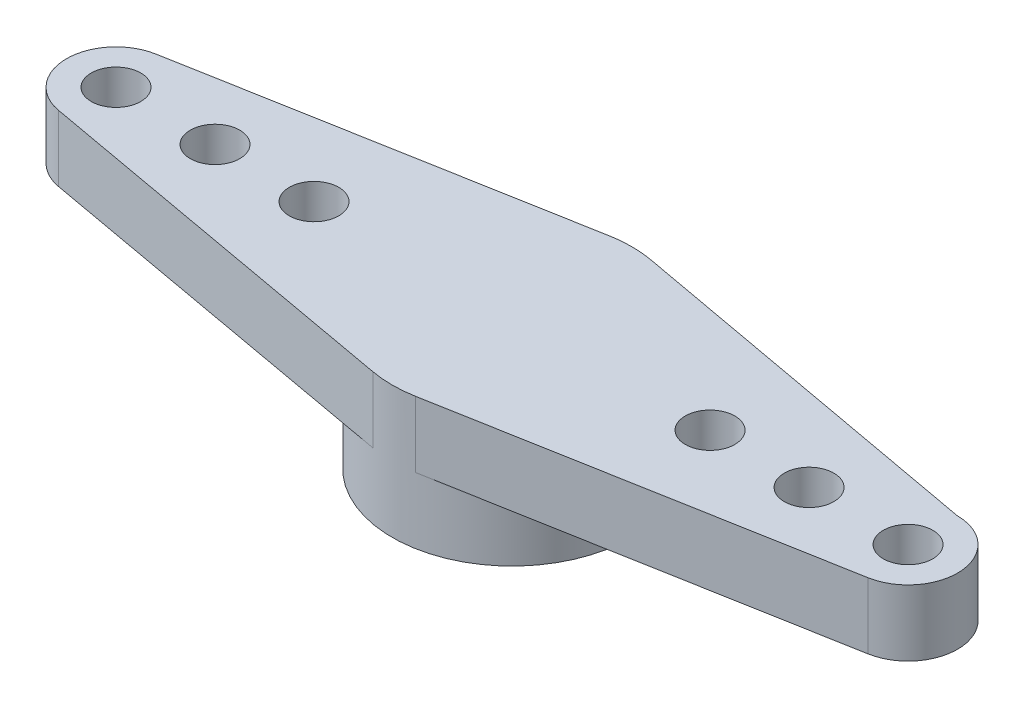
ISO-10303-21;
HEADER;
FILE_DESCRIPTION(('STEP AP214'),'2;1');
FILE_NAME('part.step','',(''),(''),'','','');
FILE_SCHEMA(('AUTOMOTIVE_DESIGN { 1 0 10303 214 1 1 1 1 }'));
ENDSEC;
DATA;
#1=APPLICATION_CONTEXT('core data for automotive mechanical design processes');
#2=APPLICATION_PROTOCOL_DEFINITION('international standard','automotive_design',2000,#1);
#3=PRODUCT_CONTEXT('',#1,'mechanical');
#4=PRODUCT('Part','Part','',(#3));
#5=PRODUCT_RELATED_PRODUCT_CATEGORY('part','',(#4));
#6=PRODUCT_DEFINITION_FORMATION('','',#4);
#7=PRODUCT_DEFINITION_CONTEXT('part definition',#1,'design');
#8=PRODUCT_DEFINITION('design','',#6,#7);
#9=PRODUCT_DEFINITION_SHAPE('','',#8);
#10=(LENGTH_UNIT() NAMED_UNIT(*) SI_UNIT(.MILLI.,.METRE.));
#11=(NAMED_UNIT(*) PLANE_ANGLE_UNIT() SI_UNIT($,.RADIAN.));
#12=(NAMED_UNIT(*) SI_UNIT($,.STERADIAN.) SOLID_ANGLE_UNIT());
#13=UNCERTAINTY_MEASURE_WITH_UNIT(LENGTH_MEASURE(1.E-05),#10,'distance_accuracy_value','');
#14=(GEOMETRIC_REPRESENTATION_CONTEXT(3) GLOBAL_UNCERTAINTY_ASSIGNED_CONTEXT((#13)) GLOBAL_UNIT_ASSIGNED_CONTEXT((#10,
#11,#12)) REPRESENTATION_CONTEXT('',''));
#15=CARTESIAN_POINT('',(0.,0.,0.));
#16=DIRECTION('',(0.,0.,1.));
#17=DIRECTION('',(1.,0.,0.));
#18=AXIS2_PLACEMENT_3D('',#15,#16,#17);
#19=CARTESIAN_POINT('',(-12.,0.,0.));
#20=DIRECTION('',(0.,1.,0.));
#21=DIRECTION('',(0.,0.,1.));
#22=AXIS2_PLACEMENT_3D('',#19,#20,#21);
#23=PLANE('',#22);
#24=CARTESIAN_POINT('',(0.,0.,0.));
#25=DIRECTION('',(0.,-1.,0.));
#26=DIRECTION('',(0.,0.,-1.));
#27=AXIS2_PLACEMENT_3D('',#24,#25,#26);
#28=CIRCLE('',#27,3.63);
#29=CARTESIAN_POINT('',(0.651697383078079,0.,-3.57102093537537));
#30=VERTEX_POINT('',#29);
#31=CARTESIAN_POINT('',(0.644325,0.,3.57235850585786));
#32=VERTEX_POINT('',#31);
#33=EDGE_CURVE('E48',#30,#32,#28,.T.);
#34=ORIENTED_EDGE('',*,*,#33,.F.);
#35=DIRECTION('',(-0.983752323794868,0.,-0.179530959525641));
#36=VECTOR('',#35,1.);
#37=CARTESIAN_POINT('',(0.651697383078079,0.,-3.57102093537537));
#38=LINE('',#37,#36);
#39=CARTESIAN_POINT('',(12.,0.,-1.5));
#40=VERTEX_POINT('',#39);
#41=EDGE_CURVE('E122',#40,#30,#38,.T.);
#42=ORIENTED_EDGE('',*,*,#41,.F.);
#43=CARTESIAN_POINT('',(12.,0.,0.));
#44=DIRECTION('',(0.,1.,0.));
#45=DIRECTION('',(0.,0.,1.));
#46=AXIS2_PLACEMENT_3D('',#43,#44,#45);
#47=CIRCLE('',#46,1.5);
#48=CARTESIAN_POINT('',(12.26625,0.,1.47618120076771));
#49=VERTEX_POINT('',#48);
#50=EDGE_CURVE('E143',#49,#40,#47,.T.);
#51=ORIENTED_EDGE('',*,*,#50,.F.);
#52=DIRECTION('',(0.984120800511807,0.,-0.1775));
#53=VECTOR('',#52,1.);
#54=CARTESIAN_POINT('',(0.644325,0.,3.57235850585786));
#55=LINE('',#54,#53);
#56=EDGE_CURVE('E141',#32,#49,#55,.T.);
#57=ORIENTED_EDGE('',*,*,#56,.F.);
#58=EDGE_LOOP('',(#34,#42,#51,#57));
#59=FACE_BOUND('',#58,.T.);
#60=CARTESIAN_POINT('',(6.,0.,0.));
#61=DIRECTION('',(0.,1.,0.));
#62=DIRECTION('',(0.,0.,1.));
#63=AXIS2_PLACEMENT_3D('',#60,#61,#62);
#64=CIRCLE('',#63,0.75);
#65=CARTESIAN_POINT('',(6.,0.,0.750000000000042));
#66=VERTEX_POINT('',#65);
#67=EDGE_CURVE('E187',#66,#66,#64,.T.);
#68=ORIENTED_EDGE('',*,*,#67,.T.);
#69=EDGE_LOOP('',(#68));
#70=FACE_BOUND('',#69,.T.);
#71=CARTESIAN_POINT('',(9.,0.,0.));
#72=DIRECTION('',(0.,1.,0.));
#73=DIRECTION('',(0.,0.,1.));
#74=AXIS2_PLACEMENT_3D('',#71,#72,#73);
#75=CIRCLE('',#74,0.75);
#76=CARTESIAN_POINT('',(9.,0.,0.750000000000021));
#77=VERTEX_POINT('',#76);
#78=EDGE_CURVE('E210',#77,#77,#75,.T.);
#79=ORIENTED_EDGE('',*,*,#78,.T.);
#80=EDGE_LOOP('',(#79));
#81=FACE_BOUND('',#80,.T.);
#82=CARTESIAN_POINT('',(12.,0.,0.));
#83=DIRECTION('',(0.,1.,0.));
#84=DIRECTION('',(0.,0.,1.));
#85=AXIS2_PLACEMENT_3D('',#82,#83,#84);
#86=CIRCLE('',#85,0.75);
#87=CARTESIAN_POINT('',(12.,0.,0.75));
#88=VERTEX_POINT('',#87);
#89=EDGE_CURVE('E138',#88,#88,#86,.T.);
#90=ORIENTED_EDGE('',*,*,#89,.T.);
#91=EDGE_LOOP('',(#90));
#92=FACE_BOUND('',#91,.T.);
#93=ADVANCED_FACE('F37',(#59,#70,#81,#92),#23,.F.);
#94=CARTESIAN_POINT('',(-12.,2.,0.));
#95=DIRECTION('',(0.,-1.,0.));
#96=DIRECTION('',(0.,0.,-1.));
#97=AXIS2_PLACEMENT_3D('',#94,#95,#96);
#98=CYLINDRICAL_SURFACE('',#97,1.5);
#99=CARTESIAN_POINT('',(-12.,0.,0.));
#100=DIRECTION('',(0.,1.,0.));
#101=DIRECTION('',(0.,0.,1.));
#102=AXIS2_PLACEMENT_3D('',#99,#100,#101);
#103=CIRCLE('',#102,1.5);
#104=CARTESIAN_POINT('',(-12.26625,0.,-1.47618120076771));
#105=VERTEX_POINT('',#104);
#106=CARTESIAN_POINT('',(-12.26625,0.,1.47618120076771));
#107=VERTEX_POINT('',#106);
#108=EDGE_CURVE('E134',#105,#107,#103,.T.);
#109=ORIENTED_EDGE('',*,*,#108,.T.);
#110=DIRECTION('',(0.,-1.,0.));
#111=VECTOR('',#110,1.);
#112=CARTESIAN_POINT('',(-12.26625,2.,1.47618120076771));
#113=LINE('',#112,#111);
#114=CARTESIAN_POINT('',(-12.26625,2.,1.47618120076771));
#115=VERTEX_POINT('',#114);
#116=EDGE_CURVE('E41',#115,#107,#113,.T.);
#117=ORIENTED_EDGE('',*,*,#116,.F.);
#118=CARTESIAN_POINT('',(-12.,2.,0.));
#119=DIRECTION('',(0.,1.,0.));
#120=DIRECTION('',(0.,0.,1.));
#121=AXIS2_PLACEMENT_3D('',#118,#119,#120);
#122=CIRCLE('',#121,1.5);
#123=CARTESIAN_POINT('',(-12.26625,2.,-1.47618120076771));
#124=VERTEX_POINT('',#123);
#125=EDGE_CURVE('E147',#124,#115,#122,.T.);
#126=ORIENTED_EDGE('',*,*,#125,.F.);
#127=DIRECTION('',(0.,-1.,0.));
#128=VECTOR('',#127,1.);
#129=CARTESIAN_POINT('',(-12.26625,2.,-1.47618120076771));
#130=LINE('',#129,#128);
#131=EDGE_CURVE('E130',#124,#105,#130,.T.);
#132=ORIENTED_EDGE('',*,*,#131,.T.);
#133=EDGE_LOOP('',(#109,#117,#126,#132));
#134=FACE_BOUND('',#133,.T.);
#135=ADVANCED_FACE('F39',(#134),#98,.T.);
#136=CARTESIAN_POINT('',(-12.26625,2.,1.47618120076771));
#137=DIRECTION('',(0.1775,0.,-0.984120800511807));
#138=DIRECTION('',(-0.984120800511807,0.,-0.1775));
#139=AXIS2_PLACEMENT_3D('',#136,#137,#138);
#140=PLANE('',#139);
#141=DIRECTION('',(0.984120800511807,0.,0.1775));
#142=VECTOR('',#141,1.);
#143=CARTESIAN_POINT('',(-12.26625,0.,1.47618120076771));
#144=LINE('',#143,#142);
#145=CARTESIAN_POINT('',(-0.644325,0.,3.57235850585786));
#146=VERTEX_POINT('',#145);
#147=EDGE_CURVE('E137',#107,#146,#144,.T.);
#148=ORIENTED_EDGE('',*,*,#147,.T.);
#149=DIRECTION('',(0.,-1.,0.));
#150=VECTOR('',#149,1.);
#151=CARTESIAN_POINT('',(-0.644325,2.,3.57235850585786));
#152=LINE('',#151,#150);
#153=CARTESIAN_POINT('',(-0.644325,2.,3.57235850585786));
#154=VERTEX_POINT('',#153);
#155=EDGE_CURVE('E156',#154,#146,#152,.T.);
#156=ORIENTED_EDGE('',*,*,#155,.F.);
#157=DIRECTION('',(0.984120800511807,0.,0.1775));
#158=VECTOR('',#157,1.);
#159=CARTESIAN_POINT('',(-12.26625,2.,1.47618120076771));
#160=LINE('',#159,#158);
#161=EDGE_CURVE('E90',#115,#154,#160,.T.);
#162=ORIENTED_EDGE('',*,*,#161,.F.);
#163=ORIENTED_EDGE('',*,*,#116,.T.);
#164=EDGE_LOOP('',(#148,#156,#162,#163));
#165=FACE_BOUND('',#164,.T.);
#166=ADVANCED_FACE('F159',(#165),#140,.F.);
#167=CARTESIAN_POINT('',(0.644325,2.,3.57235850585786));
#168=DIRECTION('',(-0.1775,0.,-0.984120800511807));
#169=DIRECTION('',(-0.984120800511807,0.,0.1775));
#170=AXIS2_PLACEMENT_3D('',#167,#168,#169);
#171=PLANE('',#170);
#172=ORIENTED_EDGE('',*,*,#56,.T.);
#173=DIRECTION('',(0.,-1.,0.));
#174=VECTOR('',#173,1.);
#175=CARTESIAN_POINT('',(12.26625,2.,1.47618120076771));
#176=LINE('',#175,#174);
#177=CARTESIAN_POINT('',(12.26625,2.,1.47618120076771));
#178=VERTEX_POINT('',#177);
#179=EDGE_CURVE('E151',#178,#49,#176,.T.);
#180=ORIENTED_EDGE('',*,*,#179,.F.);
#181=DIRECTION('',(0.984120800511807,0.,-0.1775));
#182=VECTOR('',#181,1.);
#183=CARTESIAN_POINT('',(0.644325,2.,3.57235850585786));
#184=LINE('',#183,#182);
#185=CARTESIAN_POINT('',(0.644325,2.,3.57235850585786));
#186=VERTEX_POINT('',#185);
#187=EDGE_CURVE('E222',#186,#178,#184,.T.);
#188=ORIENTED_EDGE('',*,*,#187,.F.);
#189=DIRECTION('',(0.,-1.,0.));
#190=VECTOR('',#189,1.);
#191=CARTESIAN_POINT('',(0.644325,2.,3.57235850585786));
#192=LINE('',#191,#190);
#193=EDGE_CURVE('E154',#186,#32,#192,.T.);
#194=ORIENTED_EDGE('',*,*,#193,.T.);
#195=EDGE_LOOP('',(#172,#180,#188,#194));
#196=FACE_BOUND('',#195,.T.);
#197=ADVANCED_FACE('F226',(#196),#171,.F.);
#198=CARTESIAN_POINT('',(12.,2.,0.));
#199=DIRECTION('',(0.,-1.,0.));
#200=DIRECTION('',(0.,0.,-1.));
#201=AXIS2_PLACEMENT_3D('',#198,#199,#200);
#202=CYLINDRICAL_SURFACE('',#201,1.5);
#203=ORIENTED_EDGE('',*,*,#50,.T.);
#204=DIRECTION('',(0.,-1.,0.));
#205=VECTOR('',#204,1.);
#206=CARTESIAN_POINT('',(12.,2.,-1.5));
#207=LINE('',#206,#205);
#208=CARTESIAN_POINT('',(12.,2.,-1.5));
#209=VERTEX_POINT('',#208);
#210=EDGE_CURVE('E124',#209,#40,#207,.T.);
#211=ORIENTED_EDGE('',*,*,#210,.F.);
#212=CARTESIAN_POINT('',(12.,2.,0.));
#213=DIRECTION('',(0.,1.,0.));
#214=DIRECTION('',(0.,0.,1.));
#215=AXIS2_PLACEMENT_3D('',#212,#213,#214);
#216=CIRCLE('',#215,1.5);
#217=EDGE_CURVE('E111',#178,#209,#216,.T.);
#218=ORIENTED_EDGE('',*,*,#217,.F.);
#219=ORIENTED_EDGE('',*,*,#179,.T.);
#220=EDGE_LOOP('',(#203,#211,#218,#219));
#221=FACE_BOUND('',#220,.T.);
#222=ADVANCED_FACE('F228',(#221),#202,.T.);
#223=CARTESIAN_POINT('',(0.651697383078079,2.,-3.57102093537537));
#224=DIRECTION('',(-0.179530959525641,0.,0.983752323794868));
#225=DIRECTION('',(0.983752323794868,0.,0.179530959525641));
#226=AXIS2_PLACEMENT_3D('',#223,#224,#225);
#227=PLANE('',#226);
#228=ORIENTED_EDGE('',*,*,#41,.T.);
#229=DIRECTION('',(0.,-1.,0.));
#230=VECTOR('',#229,1.);
#231=CARTESIAN_POINT('',(0.651697383078079,2.,-3.57102093537537));
#232=LINE('',#231,#230);
#233=CARTESIAN_POINT('',(0.651697383078079,2.,-3.57102093537537));
#234=VERTEX_POINT('',#233);
#235=EDGE_CURVE('E118',#234,#30,#232,.T.);
#236=ORIENTED_EDGE('',*,*,#235,.F.);
#237=DIRECTION('',(-0.983752323794868,0.,-0.179530959525641));
#238=VECTOR('',#237,1.);
#239=CARTESIAN_POINT('',(0.651697383078079,2.,-3.57102093537537));
#240=LINE('',#239,#238);
#241=EDGE_CURVE('E105',#209,#234,#240,.T.);
#242=ORIENTED_EDGE('',*,*,#241,.F.);
#243=ORIENTED_EDGE('',*,*,#210,.T.);
#244=EDGE_LOOP('',(#228,#236,#242,#243));
#245=FACE_BOUND('',#244,.T.);
#246=ADVANCED_FACE('F119',(#245),#227,.F.);
#247=CARTESIAN_POINT('',(0.,2.,0.));
#248=DIRECTION('',(0.,-1.,0.));
#249=DIRECTION('',(0.,0.,-1.));
#250=AXIS2_PLACEMENT_3D('',#247,#248,#249);
#251=CYLINDRICAL_SURFACE('',#250,3.63);
#252=ORIENTED_EDGE('',*,*,#235,.T.);
#253=ORIENTED_EDGE('',*,*,#33,.T.);
#254=ORIENTED_EDGE('',*,*,#193,.F.);
#255=CARTESIAN_POINT('',(0.,2.,0.));
#256=DIRECTION('',(0.,1.,0.));
#257=DIRECTION('',(0.,0.,1.));
#258=AXIS2_PLACEMENT_3D('',#255,#256,#257);
#259=CIRCLE('',#258,3.63);
#260=EDGE_CURVE('E220',#154,#186,#259,.T.);
#261=ORIENTED_EDGE('',*,*,#260,.F.);
#262=ORIENTED_EDGE('',*,*,#155,.T.);
#263=CARTESIAN_POINT('',(-0.644325,0.,-3.57235850585786));
#264=VERTEX_POINT('',#263);
#265=EDGE_CURVE('E11',#146,#264,#28,.T.);
#266=ORIENTED_EDGE('',*,*,#265,.T.);
#267=DIRECTION('',(0.,-1.,0.));
#268=VECTOR('',#267,1.);
#269=CARTESIAN_POINT('',(-0.644325,2.,-3.57235850585786));
#270=LINE('',#269,#268);
#271=CARTESIAN_POINT('',(-0.644325,2.,-3.57235850585786));
#272=VERTEX_POINT('',#271);
#273=EDGE_CURVE('E125',#272,#264,#270,.T.);
#274=ORIENTED_EDGE('',*,*,#273,.F.);
#275=CARTESIAN_POINT('',(0.,2.,0.));
#276=DIRECTION('',(0.,1.,0.));
#277=DIRECTION('',(0.,0.,1.));
#278=AXIS2_PLACEMENT_3D('',#275,#276,#277);
#279=CIRCLE('',#278,3.63);
#280=EDGE_CURVE('E109',#234,#272,#279,.T.);
#281=ORIENTED_EDGE('',*,*,#280,.F.);
#282=EDGE_LOOP('',(#252,#253,#254,#261,#262,#266,#274,#281));
#283=FACE_BOUND('',#282,.T.);
#284=CARTESIAN_POINT('',(0.,-2.,0.));
#285=DIRECTION('',(0.,-1.,0.));
#286=DIRECTION('',(0.,0.,-1.));
#287=AXIS2_PLACEMENT_3D('',#284,#285,#286);
#288=CIRCLE('',#287,3.63);
#289=CARTESIAN_POINT('',(0.,-2.,-3.63));
#290=VERTEX_POINT('',#289);
#291=EDGE_CURVE('E174',#290,#290,#288,.T.);
#292=ORIENTED_EDGE('',*,*,#291,.F.);
#293=EDGE_LOOP('',(#292));
#294=FACE_BOUND('',#293,.T.);
#295=ADVANCED_FACE('F127',(#283,#294),#251,.T.);
#296=CARTESIAN_POINT('',(-12.26625,2.,-1.47618120076771));
#297=DIRECTION('',(0.1775,0.,0.984120800511807));
#298=DIRECTION('',(0.984120800511807,0.,-0.1775));
#299=AXIS2_PLACEMENT_3D('',#296,#297,#298);
#300=PLANE('',#299);
#301=DIRECTION('',(-0.984120800511807,0.,0.1775));
#302=VECTOR('',#301,1.);
#303=CARTESIAN_POINT('',(-12.26625,0.,-1.47618120076771));
#304=LINE('',#303,#302);
#305=EDGE_CURVE('E81',#264,#105,#304,.T.);
#306=ORIENTED_EDGE('',*,*,#305,.T.);
#307=ORIENTED_EDGE('',*,*,#131,.F.);
#308=DIRECTION('',(-0.984120800511807,0.,0.1775));
#309=VECTOR('',#308,1.);
#310=CARTESIAN_POINT('',(-12.26625,2.,-1.47618120076771));
#311=LINE('',#310,#309);
#312=EDGE_CURVE('E56',#272,#124,#311,.T.);
#313=ORIENTED_EDGE('',*,*,#312,.F.);
#314=ORIENTED_EDGE('',*,*,#273,.T.);
#315=EDGE_LOOP('',(#306,#307,#313,#314));
#316=FACE_BOUND('',#315,.T.);
#317=ADVANCED_FACE('F257',(#316),#300,.F.);
#318=CARTESIAN_POINT('',(-12.,2.,0.));
#319=DIRECTION('',(0.,1.,0.));
#320=DIRECTION('',(0.,0.,1.));
#321=AXIS2_PLACEMENT_3D('',#318,#319,#320);
#322=PLANE('',#321);
#323=CARTESIAN_POINT('',(-12.,2.,0.));
#324=DIRECTION('',(0.,-1.,0.));
#325=DIRECTION('',(0.,0.,1.));
#326=AXIS2_PLACEMENT_3D('',#323,#324,#325);
#327=CIRCLE('',#326,0.75);
#328=CARTESIAN_POINT('',(-12.,2.,0.75));
#329=VERTEX_POINT('',#328);
#330=EDGE_CURVE('E188',#329,#329,#327,.T.);
#331=ORIENTED_EDGE('',*,*,#330,.T.);
#332=EDGE_LOOP('',(#331));
#333=FACE_BOUND('',#332,.T.);
#334=CARTESIAN_POINT('',(-9.,2.,0.));
#335=DIRECTION('',(0.,-1.,0.));
#336=DIRECTION('',(0.,0.,1.));
#337=AXIS2_PLACEMENT_3D('',#334,#335,#336);
#338=CIRCLE('',#337,0.75);
#339=CARTESIAN_POINT('',(-9.,2.,0.750000000000021));
#340=VERTEX_POINT('',#339);
#341=EDGE_CURVE('E194',#340,#340,#338,.T.);
#342=ORIENTED_EDGE('',*,*,#341,.T.);
#343=EDGE_LOOP('',(#342));
#344=FACE_BOUND('',#343,.T.);
#345=CARTESIAN_POINT('',(-6.,2.,0.));
#346=DIRECTION('',(0.,-1.,0.));
#347=DIRECTION('',(0.,0.,1.));
#348=AXIS2_PLACEMENT_3D('',#345,#346,#347);
#349=CIRCLE('',#348,0.75);
#350=CARTESIAN_POINT('',(-6.,2.,0.750000000000042));
#351=VERTEX_POINT('',#350);
#352=EDGE_CURVE('E177',#351,#351,#349,.T.);
#353=ORIENTED_EDGE('',*,*,#352,.T.);
#354=EDGE_LOOP('',(#353));
#355=FACE_BOUND('',#354,.T.);
#356=CARTESIAN_POINT('',(12.,2.,0.));
#357=DIRECTION('',(0.,1.,0.));
#358=DIRECTION('',(0.,0.,1.));
#359=AXIS2_PLACEMENT_3D('',#356,#357,#358);
#360=CIRCLE('',#359,0.75);
#361=CARTESIAN_POINT('',(12.,2.,0.75));
#362=VERTEX_POINT('',#361);
#363=EDGE_CURVE('E204',#362,#362,#360,.T.);
#364=ORIENTED_EDGE('',*,*,#363,.F.);
#365=EDGE_LOOP('',(#364));
#366=FACE_BOUND('',#365,.T.);
#367=CARTESIAN_POINT('',(9.,2.,0.));
#368=DIRECTION('',(0.,1.,0.));
#369=DIRECTION('',(0.,0.,1.));
#370=AXIS2_PLACEMENT_3D('',#367,#368,#369);
#371=CIRCLE('',#370,0.75);
#372=CARTESIAN_POINT('',(9.,2.,0.750000000000021));
#373=VERTEX_POINT('',#372);
#374=EDGE_CURVE('E207',#373,#373,#371,.T.);
#375=ORIENTED_EDGE('',*,*,#374,.F.);
#376=EDGE_LOOP('',(#375));
#377=FACE_BOUND('',#376,.T.);
#378=CARTESIAN_POINT('',(6.,2.,0.));
#379=DIRECTION('',(0.,1.,0.));
#380=DIRECTION('',(0.,0.,1.));
#381=AXIS2_PLACEMENT_3D('',#378,#379,#380);
#382=CIRCLE('',#381,0.75);
#383=CARTESIAN_POINT('',(6.,2.,0.750000000000042));
#384=VERTEX_POINT('',#383);
#385=EDGE_CURVE('E213',#384,#384,#382,.T.);
#386=ORIENTED_EDGE('',*,*,#385,.F.);
#387=EDGE_LOOP('',(#386));
#388=FACE_BOUND('',#387,.T.);
#389=ORIENTED_EDGE('',*,*,#125,.T.);
#390=ORIENTED_EDGE('',*,*,#161,.T.);
#391=ORIENTED_EDGE('',*,*,#260,.T.);
#392=ORIENTED_EDGE('',*,*,#187,.T.);
#393=ORIENTED_EDGE('',*,*,#217,.T.);
#394=ORIENTED_EDGE('',*,*,#241,.T.);
#395=ORIENTED_EDGE('',*,*,#280,.T.);
#396=ORIENTED_EDGE('',*,*,#312,.T.);
#397=EDGE_LOOP('',(#389,#390,#391,#392,#393,#394,#395,#396));
#398=FACE_BOUND('',#397,.T.);
#399=ADVANCED_FACE('F107',(#333,#344,#355,#366,#377,#388,#398),#322,.T.);
#400=ORIENTED_EDGE('',*,*,#265,.F.);
#401=ORIENTED_EDGE('',*,*,#147,.F.);
#402=ORIENTED_EDGE('',*,*,#108,.F.);
#403=ORIENTED_EDGE('',*,*,#305,.F.);
#404=EDGE_LOOP('',(#400,#401,#402,#403));
#405=FACE_BOUND('',#404,.T.);
#406=CARTESIAN_POINT('',(-12.,0.,0.));
#407=DIRECTION('',(0.,-1.,0.));
#408=DIRECTION('',(0.,0.,1.));
#409=AXIS2_PLACEMENT_3D('',#406,#407,#408);
#410=CIRCLE('',#409,0.75);
#411=CARTESIAN_POINT('',(-12.,0.,0.75));
#412=VERTEX_POINT('',#411);
#413=EDGE_CURVE('E184',#412,#412,#410,.T.);
#414=ORIENTED_EDGE('',*,*,#413,.F.);
#415=EDGE_LOOP('',(#414));
#416=FACE_BOUND('',#415,.T.);
#417=CARTESIAN_POINT('',(-9.,0.,0.));
#418=DIRECTION('',(0.,-1.,0.));
#419=DIRECTION('',(0.,0.,1.));
#420=AXIS2_PLACEMENT_3D('',#417,#418,#419);
#421=CIRCLE('',#420,0.75);
#422=CARTESIAN_POINT('',(-9.,0.,0.750000000000021));
#423=VERTEX_POINT('',#422);
#424=EDGE_CURVE('E191',#423,#423,#421,.T.);
#425=ORIENTED_EDGE('',*,*,#424,.F.);
#426=EDGE_LOOP('',(#425));
#427=FACE_BOUND('',#426,.T.);
#428=CARTESIAN_POINT('',(-6.,0.,0.));
#429=DIRECTION('',(0.,-1.,0.));
#430=DIRECTION('',(0.,0.,1.));
#431=AXIS2_PLACEMENT_3D('',#428,#429,#430);
#432=CIRCLE('',#431,0.75);
#433=CARTESIAN_POINT('',(-6.,0.,0.750000000000042));
#434=VERTEX_POINT('',#433);
#435=EDGE_CURVE('E197',#434,#434,#432,.T.);
#436=ORIENTED_EDGE('',*,*,#435,.F.);
#437=EDGE_LOOP('',(#436));
#438=FACE_BOUND('',#437,.T.);
#439=ADVANCED_FACE('F164',(#405,#416,#427,#438),#23,.F.);
#440=CARTESIAN_POINT('',(6.,0.,0.));
#441=DIRECTION('',(0.,1.,0.));
#442=DIRECTION('',(0.,0.,1.));
#443=AXIS2_PLACEMENT_3D('',#440,#441,#442);
#444=CYLINDRICAL_SURFACE('',#443,0.75);
#445=ORIENTED_EDGE('',*,*,#67,.F.);
#446=EDGE_LOOP('',(#445));
#447=FACE_BOUND('',#446,.T.);
#448=ORIENTED_EDGE('',*,*,#385,.T.);
#449=EDGE_LOOP('',(#448));
#450=FACE_BOUND('',#449,.T.);
#451=ADVANCED_FACE('F249',(#447,#450),#444,.F.);
#452=CARTESIAN_POINT('',(9.,0.,0.));
#453=DIRECTION('',(0.,1.,0.));
#454=DIRECTION('',(0.,0.,1.));
#455=AXIS2_PLACEMENT_3D('',#452,#453,#454);
#456=CYLINDRICAL_SURFACE('',#455,0.75);
#457=ORIENTED_EDGE('',*,*,#78,.F.);
#458=EDGE_LOOP('',(#457));
#459=FACE_BOUND('',#458,.T.);
#460=ORIENTED_EDGE('',*,*,#374,.T.);
#461=EDGE_LOOP('',(#460));
#462=FACE_BOUND('',#461,.T.);
#463=ADVANCED_FACE('F254',(#459,#462),#456,.F.);
#464=CARTESIAN_POINT('',(12.,0.,0.));
#465=DIRECTION('',(0.,1.,0.));
#466=DIRECTION('',(0.,0.,1.));
#467=AXIS2_PLACEMENT_3D('',#464,#465,#466);
#468=CYLINDRICAL_SURFACE('',#467,0.75);
#469=ORIENTED_EDGE('',*,*,#89,.F.);
#470=EDGE_LOOP('',(#469));
#471=FACE_BOUND('',#470,.T.);
#472=ORIENTED_EDGE('',*,*,#363,.T.);
#473=EDGE_LOOP('',(#472));
#474=FACE_BOUND('',#473,.T.);
#475=ADVANCED_FACE('F266',(#471,#474),#468,.F.);
#476=CARTESIAN_POINT('',(-6.,0.,0.));
#477=DIRECTION('',(0.,1.,0.));
#478=DIRECTION('',(0.,0.,1.));
#479=AXIS2_PLACEMENT_3D('',#476,#477,#478);
#480=CYLINDRICAL_SURFACE('',#479,0.75);
#481=ORIENTED_EDGE('',*,*,#435,.T.);
#482=EDGE_LOOP('',(#481));
#483=FACE_BOUND('',#482,.T.);
#484=ORIENTED_EDGE('',*,*,#352,.F.);
#485=EDGE_LOOP('',(#484));
#486=FACE_BOUND('',#485,.T.);
#487=ADVANCED_FACE('F270',(#483,#486),#480,.F.);
#488=CARTESIAN_POINT('',(-9.,0.,0.));
#489=DIRECTION('',(0.,1.,0.));
#490=DIRECTION('',(0.,0.,1.));
#491=AXIS2_PLACEMENT_3D('',#488,#489,#490);
#492=CYLINDRICAL_SURFACE('',#491,0.75);
#493=ORIENTED_EDGE('',*,*,#424,.T.);
#494=EDGE_LOOP('',(#493));
#495=FACE_BOUND('',#494,.T.);
#496=ORIENTED_EDGE('',*,*,#341,.F.);
#497=EDGE_LOOP('',(#496));
#498=FACE_BOUND('',#497,.T.);
#499=ADVANCED_FACE('F274',(#495,#498),#492,.F.);
#500=CARTESIAN_POINT('',(-12.,0.,0.));
#501=DIRECTION('',(0.,1.,0.));
#502=DIRECTION('',(0.,0.,1.));
#503=AXIS2_PLACEMENT_3D('',#500,#501,#502);
#504=CYLINDRICAL_SURFACE('',#503,0.75);
#505=ORIENTED_EDGE('',*,*,#413,.T.);
#506=EDGE_LOOP('',(#505));
#507=FACE_BOUND('',#506,.T.);
#508=ORIENTED_EDGE('',*,*,#330,.F.);
#509=EDGE_LOOP('',(#508));
#510=FACE_BOUND('',#509,.T.);
#511=ADVANCED_FACE('F278',(#507,#510),#504,.F.);
#512=CARTESIAN_POINT('',(0.,-2.,0.));
#513=DIRECTION('',(0.,-1.,0.));
#514=DIRECTION('',(0.,0.,-1.));
#515=AXIS2_PLACEMENT_3D('',#512,#513,#514);
#516=PLANE('',#515);
#517=ORIENTED_EDGE('',*,*,#291,.T.);
#518=EDGE_LOOP('',(#517));
#519=FACE_BOUND('',#518,.T.);
#520=CARTESIAN_POINT('',(0.,-2.,0.));
#521=DIRECTION('',(0.,-1.,0.));
#522=DIRECTION('',(0.,0.,-1.));
#523=AXIS2_PLACEMENT_3D('',#520,#521,#522);
#524=CIRCLE('',#523,2.88);
#525=CARTESIAN_POINT('',(0.,-2.,-2.88));
#526=VERTEX_POINT('',#525);
#527=EDGE_CURVE('E175',#526,#526,#524,.T.);
#528=ORIENTED_EDGE('',*,*,#527,.F.);
#529=EDGE_LOOP('',(#528));
#530=FACE_BOUND('',#529,.T.);
#531=ADVANCED_FACE('F282',(#519,#530),#516,.T.);
#532=CARTESIAN_POINT('',(0.,-2.,0.));
#533=DIRECTION('',(0.,1.,0.));
#534=DIRECTION('',(0.,0.,1.));
#535=AXIS2_PLACEMENT_3D('',#532,#533,#534);
#536=CYLINDRICAL_SURFACE('',#535,2.88);
#537=ORIENTED_EDGE('',*,*,#527,.T.);
#538=EDGE_LOOP('',(#537));
#539=FACE_BOUND('',#538,.T.);
#540=CARTESIAN_POINT('',(0.,0.,0.));
#541=DIRECTION('',(0.,-1.,0.));
#542=DIRECTION('',(0.,0.,-1.));
#543=AXIS2_PLACEMENT_3D('',#540,#541,#542);
#544=CIRCLE('',#543,2.88);
#545=CARTESIAN_POINT('',(0.,0.,-2.88));
#546=VERTEX_POINT('',#545);
#547=EDGE_CURVE('E180',#546,#546,#544,.T.);
#548=ORIENTED_EDGE('',*,*,#547,.F.);
#549=EDGE_LOOP('',(#548));
#550=FACE_BOUND('',#549,.T.);
#551=ADVANCED_FACE('F246',(#539,#550),#536,.F.);
#552=ORIENTED_EDGE('',*,*,#547,.T.);
#553=EDGE_LOOP('',(#552));
#554=FACE_BOUND('',#553,.T.);
#555=ADVANCED_FACE('F239',(#554),#23,.F.);
#556=CLOSED_SHELL('',(#93,#135,#166,#197,#222,#246,#295,#317,#399,#439,#451,#463,#475,#487,#499,
#511,#531,#551,#555));
#557=MANIFOLD_SOLID_BREP('B2',#556);
#558=ADVANCED_BREP_SHAPE_REPRESENTATION('',(#18,#557),#14);
#559=SHAPE_DEFINITION_REPRESENTATION(#9,#558);
ENDSEC;
END-ISO-10303-21;
